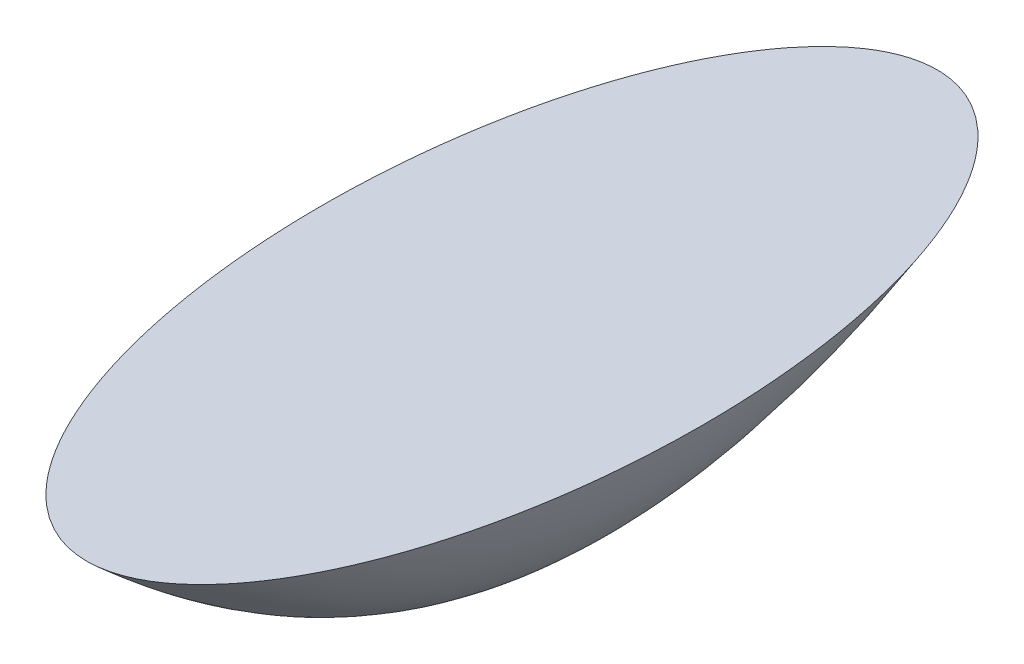
ISO-10303-21;
HEADER;
FILE_DESCRIPTION(('STEP AP214'),'2;1');
FILE_NAME('part.step','',(''),(''),'','','');
FILE_SCHEMA(('AUTOMOTIVE_DESIGN { 1 0 10303 214 1 1 1 1 }'));
ENDSEC;
DATA;
#1=APPLICATION_CONTEXT('core data for automotive mechanical design processes');
#2=APPLICATION_PROTOCOL_DEFINITION('international standard','automotive_design',2000,#1);
#3=PRODUCT_CONTEXT('',#1,'mechanical');
#4=PRODUCT('Part','Part','',(#3));
#5=PRODUCT_RELATED_PRODUCT_CATEGORY('part','',(#4));
#6=PRODUCT_DEFINITION_FORMATION('','',#4);
#7=PRODUCT_DEFINITION_CONTEXT('part definition',#1,'design');
#8=PRODUCT_DEFINITION('design','',#6,#7);
#9=PRODUCT_DEFINITION_SHAPE('','',#8);
#10=(LENGTH_UNIT() NAMED_UNIT(*) SI_UNIT(.MILLI.,.METRE.));
#11=(NAMED_UNIT(*) PLANE_ANGLE_UNIT() SI_UNIT($,.RADIAN.));
#12=(NAMED_UNIT(*) SI_UNIT($,.STERADIAN.) SOLID_ANGLE_UNIT());
#13=UNCERTAINTY_MEASURE_WITH_UNIT(LENGTH_MEASURE(1.E-05),#10,'distance_accuracy_value','');
#14=(GEOMETRIC_REPRESENTATION_CONTEXT(3) GLOBAL_UNCERTAINTY_ASSIGNED_CONTEXT((#13)) GLOBAL_UNIT_ASSIGNED_CONTEXT((#10,
#11,#12)) REPRESENTATION_CONTEXT('',''));
#15=CARTESIAN_POINT('',(0.,0.,0.));
#16=DIRECTION('',(0.,0.,1.));
#17=DIRECTION('',(1.,0.,0.));
#18=AXIS2_PLACEMENT_3D('',#15,#16,#17);
#19=CARTESIAN_POINT('',(-131.817131851053,275.377780694619,-329.538349323902));
#20=CARTESIAN_POINT('',(-131.817131851053,165.529295048695,-219.689863667199));
#21=CARTESIAN_POINT('',(-131.817131851053,110.605053421941,-109.841375351829));
#22=CARTESIAN_POINT('',(-131.817131851053,110.605053421941,109.855594345668));
#23=CARTESIAN_POINT('',(-131.817131851053,165.529296654307,219.704075715817));
#24=CARTESIAN_POINT('',(-131.817131851053,275.377780694807,329.552559767096));
#25=CARTESIAN_POINT('',(0.00104996689613364,11.7414170596769,-329.538349323902));
#26=CARTESIAN_POINT('',(0.00104996689613364,-98.1070685884025,-219.689863669355));
#27=CARTESIAN_POINT('',(0.00104996689613364,-153.031310213001,-109.841375351829));
#28=CARTESIAN_POINT('',(0.00104996689613364,-153.031310213001,109.855594345668));
#29=CARTESIAN_POINT('',(0.00104996689613364,-98.1070669827903,219.704075717973));
#30=CARTESIAN_POINT('',(0.00104996689613364,11.741417059865,329.552559767096));
#31=CARTESIAN_POINT('',(131.819231784845,275.377780695602,-329.538349323902));
#32=CARTESIAN_POINT('',(131.819231784845,165.529295049679,-219.689863667199));
#33=CARTESIAN_POINT('',(131.819231784845,110.605053422924,-109.841375351829));
#34=CARTESIAN_POINT('',(131.819231784845,110.605053422924,109.855594345668));
#35=CARTESIAN_POINT('',(131.819231784845,165.529296655291,219.704075715817));
#36=CARTESIAN_POINT('',(131.819231784845,275.37778069579,329.552559767096));
#37=B_SPLINE_SURFACE_WITH_KNOTS('',2,3,((#19,#20,#21,#22,#23,#24),(#25,#26,#27,#28,#29,#30),
(#31,#32,#33,#34,#35,#36)),.UNSPECIFIED.,.F.,.F.,.F.,(3,3),(4,2,4),(0.,1.),(0.,
0.499999980539483,1.),.UNSPECIFIED.);
#38=CARTESIAN_POINT('',(131.819231784845,110.605053422911,0.00710522449427424));
#39=CARTESIAN_POINT('',(131.819236901914,110.605053422914,-5.6312068840726));
#40=CARTESIAN_POINT('',(131.746924535443,110.605053422902,-11.2696097745448));
#41=CARTESIAN_POINT('',(131.457151012734,110.605053422893,-22.5431106804651));
#42=CARTESIAN_POINT('',(131.239677905515,110.605053422896,-28.1782083855644));
#43=CARTESIAN_POINT('',(130.657948351386,110.605053422899,-39.4413551495135));
#44=CARTESIAN_POINT('',(130.293678881957,110.605053422898,-45.0694035385636));
#45=CARTESIAN_POINT('',(129.415589206601,110.605053422897,-56.3145848945942));
#46=CARTESIAN_POINT('',(128.90174979692,110.605053422897,-61.9317163666315));
#47=CARTESIAN_POINT('',(127.719309885073,110.605053422897,-73.162207951627));
#48=CARTESIAN_POINT('',(127.050370700617,110.605053422897,-78.7755324507598));
#49=CARTESIAN_POINT('',(125.553059882345,110.605053422897,-89.980808232976));
#50=CARTESIAN_POINT('',(124.724694895729,110.605053422897,-95.5727603972603));
#51=CARTESIAN_POINT('',(123.357472267486,110.605053422897,-103.939704413103));
#52=CARTESIAN_POINT('',(122.880988198742,110.605053422897,-106.725002988963));
#53=CARTESIAN_POINT('',(121.885389325326,110.605053422897,-112.287958120392));
#54=CARTESIAN_POINT('',(121.366275120903,110.605053422897,-115.065614782993));
#55=CARTESIAN_POINT('',(120.284339744277,110.605053422897,-120.611998687119));
#56=CARTESIAN_POINT('',(119.72152475523,110.605053422897,-123.380727134357));
#57=CARTESIAN_POINT('',(118.550834270128,110.605053422897,-128.908605362329));
#58=CARTESIAN_POINT('',(117.942959396341,110.605053422897,-131.667755274791));
#59=CARTESIAN_POINT('',(116.570652850811,110.605053422897,-137.655562346406));
#60=CARTESIAN_POINT('',(115.7974037215,110.605053422897,-140.882204896665));
#61=CARTESIAN_POINT('',(114.184126891419,110.605053422897,-147.318724459241));
#62=CARTESIAN_POINT('',(113.344100052728,110.605053422897,-150.528601687424));
#63=CARTESIAN_POINT('',(111.594203591743,110.605053422897,-156.929431737577));
#64=CARTESIAN_POINT('',(110.684331142427,110.605053422897,-160.120383787908));
#65=CARTESIAN_POINT('',(108.791174756168,110.605053422897,-166.481051144587));
#66=CARTESIAN_POINT('',(107.807878566599,110.605053422897,-169.650762809828));
#67=CARTESIAN_POINT('',(105.763679446016,110.605053422897,-175.966466755615));
#68=CARTESIAN_POINT('',(104.702746514373,110.605053422897,-179.11244934317));
#69=CARTESIAN_POINT('',(102.503822894573,110.605053422897,-185.362296014735));
#70=CARTESIAN_POINT('',(101.366181322365,110.605053422897,-188.466282714375));
#71=CARTESIAN_POINT('',(99.0046275219216,110.605053422897,-194.641630934218));
#72=CARTESIAN_POINT('',(97.780708215792,110.605053422897,-197.712989753917));
#73=CARTESIAN_POINT('',(95.2412366965442,110.605053422897,-203.816516992132));
#74=CARTESIAN_POINT('',(93.9257133938889,110.605053422897,-206.848697420489));
#75=CARTESIAN_POINT('',(91.1965950613179,110.605053422897,-212.867007276454));
#76=CARTESIAN_POINT('',(89.7830488651813,110.605053422897,-215.853158741592));
#77=CARTESIAN_POINT('',(87.5832802864457,110.605053422897,-220.292237558648));
#78=CARTESIAN_POINT('',(86.8369106774038,110.605053422897,-221.765002306232));
#79=CARTESIAN_POINT('',(85.3165132278712,110.605053422897,-224.696170793528));
#80=CARTESIAN_POINT('',(84.5424860691656,110.605053422897,-226.154574886116));
#81=CARTESIAN_POINT('',(83.0040807956517,110.605053422897,-228.98495829733));
#82=CARTESIAN_POINT('',(82.2410740723168,110.605053422897,-230.357682920635));
#83=CARTESIAN_POINT('',(80.6879395647974,110.605053422897,-233.087666798938));
#84=CARTESIAN_POINT('',(79.8978125385209,110.605053422897,-234.444926484712));
#85=CARTESIAN_POINT('',(78.2892962083819,110.605053422897,-237.142575265063));
#86=CARTESIAN_POINT('',(77.4709074088112,110.605053422897,-238.482964660085));
#87=CARTESIAN_POINT('',(75.8046435670021,110.605053422897,-241.145302266543));
#88=CARTESIAN_POINT('',(74.9567685843804,110.605053422897,-242.467250515257));
#89=CARTESIAN_POINT('',(73.2286304641777,110.605053422897,-245.093363521077));
#90=CARTESIAN_POINT('',(72.3483098279402,110.605053422897,-246.397490479856));
#91=CARTESIAN_POINT('',(70.5553949961699,110.605053422897,-248.983410870888));
#92=CARTESIAN_POINT('',(69.6428004488697,110.605053422897,-250.265204059488));
#93=CARTESIAN_POINT('',(67.783868257861,110.605053422897,-252.804176701715));
#94=CARTESIAN_POINT('',(66.8375296700955,110.605053422897,-254.061355465176));
#95=CARTESIAN_POINT('',(64.9096707842895,110.605053422897,-256.548368857336));
#96=CARTESIAN_POINT('',(63.9281518500937,110.605053422897,-257.77820454306));
#97=CARTESIAN_POINT('',(61.5803742579378,110.605053422897,-260.630318653604));
#98=CARTESIAN_POINT('',(60.1990645654695,110.605053422897,-262.240271819415));
#99=CARTESIAN_POINT('',(57.3655704647338,110.605053422897,-265.396834571661));
#100=CARTESIAN_POINT('',(55.9133826977143,110.605053422897,-266.943441149844));
#101=CARTESIAN_POINT('',(52.9337285995371,110.605053422897,-269.96364434383));
#102=CARTESIAN_POINT('',(51.406237101524,110.605053422897,-271.437216216602));
#103=CARTESIAN_POINT('',(48.2771502822262,110.605053422897,-274.294728039016));
#104=CARTESIAN_POINT('',(46.6757741920469,110.605053422897,-275.678907173716));
#105=CARTESIAN_POINT('',(43.3923947003062,110.605053422897,-278.347654140954));
#106=CARTESIAN_POINT('',(41.7104117081302,110.605053422897,-279.632246975018));
#107=CARTESIAN_POINT('',(38.2648439864844,110.605053422897,-282.084913000478));
#108=CARTESIAN_POINT('',(36.5013150012716,110.605053422897,-283.253064116005));
#109=CARTESIAN_POINT('',(33.1046001727457,110.605053422897,-285.325242310632));
#110=CARTESIAN_POINT('',(31.4805573525182,110.605053422897,-286.244171964807));
#111=CARTESIAN_POINT('',(28.9984561075242,110.605053422897,-287.533373210003));
#112=CARTESIAN_POINT('',(28.1633814423248,110.605053422897,-287.948256413143));
#113=CARTESIAN_POINT('',(26.4783267528622,110.605053422897,-288.74649515801));
#114=CARTESIAN_POINT('',(25.6283479937347,110.605053422897,-289.129853360172));
#115=CARTESIAN_POINT('',(23.9146736729547,110.605053422897,-289.862970876564));
#116=CARTESIAN_POINT('',(23.0509875046789,110.605053422897,-290.212752132236));
#117=CARTESIAN_POINT('',(21.310270219246,110.605053422897,-290.87714724743));
#118=CARTESIAN_POINT('',(20.4332404196476,110.605053422897,-291.191764553787));
#119=CARTESIAN_POINT('',(18.6666711994427,110.605053422897,-291.784133385517));
#120=CARTESIAN_POINT('',(17.777130236528,110.605053422897,-292.061880320869));
#121=CARTESIAN_POINT('',(15.986978898394,110.605053422897,-292.578760023272));
#122=CARTESIAN_POINT('',(15.0863693328072,110.605053422897,-292.817895596742));
#123=CARTESIAN_POINT('',(12.9625664889716,110.605053422897,-293.331718388378));
#124=CARTESIAN_POINT('',(11.7353947087432,110.605053422897,-293.590156795481));
#125=CARTESIAN_POINT('',(9.26744075196084,110.605053422897,-294.031154519234));
#126=CARTESIAN_POINT('',(8.02665803387199,110.605053422897,-294.21371080546));
#127=CARTESIAN_POINT('',(5.53608468520924,110.605053422897,-294.500543952638));
#128=CARTESIAN_POINT('',(4.28629438605396,110.605053422897,-294.604823678947));
#129=CARTESIAN_POINT('',(1.78296383283059,110.605053422897,-294.733669153628));
#130=CARTESIAN_POINT('',(0.529424783189259,110.605053422897,-294.75825822075));
#131=CARTESIAN_POINT('',(-1.97670366219857,110.605053422897,-294.727452805287));
#132=CARTESIAN_POINT('',(-3.22929301678431,110.605053422897,-294.672055034389));
#133=CARTESIAN_POINT('',(-5.72833600614614,110.605053422897,-294.482027279575));
#134=CARTESIAN_POINT('',(-6.97479035670515,110.605053422897,-294.347406770832));
#135=CARTESIAN_POINT('',(-9.04867616497311,110.605053422897,-294.057790707137));
#136=CARTESIAN_POINT('',(-9.87914594911175,110.605053422897,-293.924043571924));
#137=CARTESIAN_POINT('',(-11.5339375516866,110.605053422897,-293.622475175459));
#138=CARTESIAN_POINT('',(-12.3582590720268,110.605053422897,-293.454652273052));
#139=CARTESIAN_POINT('',(-13.9992889430298,110.605053422897,-293.085913658782));
#140=CARTESIAN_POINT('',(-14.8159986785882,110.605053422897,-292.885004096029));
#141=CARTESIAN_POINT('',(-16.4409222821768,110.605053422897,-292.451132641142));
#142=CARTESIAN_POINT('',(-17.2491354152515,110.605053422897,-292.218168000404));
#143=CARTESIAN_POINT('',(-18.8562438569173,110.605053422897,-291.721310301097));
#144=CARTESIAN_POINT('',(-19.6551365101579,110.605053422897,-291.457408654444));
#145=CARTESIAN_POINT('',(-21.2425469465675,110.605053422897,-290.899997187327));
#146=CARTESIAN_POINT('',(-22.0310638002047,110.605053422897,-290.606484734274));
#147=CARTESIAN_POINT('',(-24.3800368220498,110.605053422897,-289.683438677767));
#148=CARTESIAN_POINT('',(-25.9240132083516,110.605053422897,-289.011365899978));
#149=CARTESIAN_POINT('',(-28.5663761838842,110.605053422897,-287.753688274746));
#150=CARTESIAN_POINT('',(-29.6759526039601,110.605053422897,-287.19124758773));
#151=CARTESIAN_POINT('',(-31.8675416207453,110.605053422897,-286.014709092202));
#152=CARTESIAN_POINT('',(-32.9495514263006,110.605053422897,-285.400606079682));
#153=CARTESIAN_POINT('',(-35.0855742399466,110.605053422897,-284.124769842363));
#154=CARTESIAN_POINT('',(-36.1395772472485,110.605053422897,-283.46301990837));
#155=CARTESIAN_POINT('',(-38.2188712178073,110.605053422897,-282.09611144669));
#156=CARTESIAN_POINT('',(-39.2441629364445,110.605053422897,-281.390954062596));
#157=CARTESIAN_POINT('',(-42.2814746110068,110.605053422897,-279.212784954476));
#158=CARTESIAN_POINT('',(-44.2507783262192,110.605053422897,-277.679585419671));
#159=CARTESIAN_POINT('',(-47.1202574825088,110.605053422897,-275.280546991124));
#160=CARTESIAN_POINT('',(-48.0627219576209,110.605053422897,-274.464278772343));
#161=CARTESIAN_POINT('',(-49.920415842759,110.605053422897,-272.801262407115));
#162=CARTESIAN_POINT('',(-50.8356456289027,110.605053422897,-271.954514681955));
#163=CARTESIAN_POINT('',(-53.2771723434341,110.605053422897,-269.6247448403));
#164=CARTESIAN_POINT('',(-54.7780924498219,110.605053422897,-268.115060803884));
#165=CARTESIAN_POINT('',(-57.7068081152078,110.605053422897,-265.025522494329));
#166=CARTESIAN_POINT('',(-59.1345735583322,110.605053422897,-263.445639814103));
#167=CARTESIAN_POINT('',(-61.9210612744457,110.605053422897,-260.224964002042));
#168=CARTESIAN_POINT('',(-63.279751149909,110.605053422897,-258.584142902197));
#169=CARTESIAN_POINT('',(-65.9313082690923,110.605053422897,-255.250318530862));
#170=CARTESIAN_POINT('',(-67.2241763261901,110.605053422897,-253.557315904608));
#171=CARTESIAN_POINT('',(-69.7504138243774,110.605053422897,-250.122420574327));
#172=CARTESIAN_POINT('',(-70.9836605793192,110.605053422897,-248.380437829042));
#173=CARTESIAN_POINT('',(-73.3910603718785,110.605053422897,-244.857141519316));
#174=CARTESIAN_POINT('',(-74.5652353837155,110.605053422897,-243.075842940166));
#175=CARTESIAN_POINT('',(-76.8582490683516,110.605053422897,-239.47820299065));
#176=CARTESIAN_POINT('',(-77.9770912901221,110.605053422897,-237.661863878151));
#177=CARTESIAN_POINT('',(-80.162627808021,110.605053422897,-233.998056173215));
#178=CARTESIAN_POINT('',(-81.2293208326219,110.605053422897,-232.150586823221));
#179=CARTESIAN_POINT('',(-83.1206306032499,110.605053422897,-228.772270775688));
#180=CARTESIAN_POINT('',(-83.9535354520748,110.605053422897,-227.246050724681));
#181=CARTESIAN_POINT('',(-85.5879747645065,110.605053422897,-224.176867517481));
#182=CARTESIAN_POINT('',(-86.3895085254266,110.605053422897,-222.633903987236));
#183=CARTESIAN_POINT('',(-87.9627699619254,110.605053422897,-219.532180740632));
#184=CARTESIAN_POINT('',(-88.7344870193627,110.605053422897,-217.973415642076));
#185=CARTESIAN_POINT('',(-90.2490333134034,110.605053422897,-214.841899758221));
#186=CARTESIAN_POINT('',(-90.991861908398,110.605053422897,-213.269148663248));
#187=CARTESIAN_POINT('',(-93.1794810193822,110.605053422897,-208.530042449978));
#188=CARTESIAN_POINT('',(-94.5826267160743,110.605053422897,-205.344375411423));
#189=CARTESIAN_POINT('',(-97.2863062576427,110.605053422897,-198.928679909541));
#190=CARTESIAN_POINT('',(-98.5868037365406,110.605053422897,-195.698636196132));
#191=CARTESIAN_POINT('',(-101.091498832431,110.605053422897,-189.201876137843));
#192=CARTESIAN_POINT('',(-102.295706630097,110.605053422897,-185.935163711691));
#193=CARTESIAN_POINT('',(-104.617143546029,110.605053422897,-179.361009906165));
#194=CARTESIAN_POINT('',(-105.734126009822,110.605053422897,-176.053481627497));
#195=CARTESIAN_POINT('',(-107.882214278505,110.605053422897,-169.412364418261));
#196=CARTESIAN_POINT('',(-108.913358821305,110.605053422897,-166.078787994159));
#197=CARTESIAN_POINT('',(-110.894699925456,110.605053422897,-159.38838373367));
#198=CARTESIAN_POINT('',(-111.844911563301,110.605053422897,-156.03156035435));
#199=CARTESIAN_POINT('',(-113.668529727862,110.605053422897,-149.297253985471));
#200=CARTESIAN_POINT('',(-114.541938424678,110.605053422897,-145.919771582527));
#201=CARTESIAN_POINT('',(-116.215469004955,110.605053422897,-139.146547482309));
#202=CARTESIAN_POINT('',(-117.015587451659,110.605053422897,-135.75080493667));
#203=CARTESIAN_POINT('',(-118.393795054525,110.605053422897,-129.618481904476));
#204=CARTESIAN_POINT('',(-118.984450416483,110.605053422897,-126.884714456938));
#205=CARTESIAN_POINT('',(-120.121923040819,110.605053422897,-121.408041176267));
#206=CARTESIAN_POINT('',(-120.66873977088,110.605053422897,-118.66513523259));
#207=CARTESIAN_POINT('',(-121.719889095145,110.605053422897,-113.170460634292));
#208=CARTESIAN_POINT('',(-122.224210631133,110.605053422897,-110.41868986507));
#209=CARTESIAN_POINT('',(-123.191302239708,110.605053422897,-104.907844679317));
#210=CARTESIAN_POINT('',(-123.654071750167,110.605053422897,-102.148770164499));
#211=CARTESIAN_POINT('',(-124.98187245884,110.605053422897,-93.8597450899949));
#212=CARTESIAN_POINT('',(-125.786026505541,110.605053422897,-88.3199321877057));
#213=CARTESIAN_POINT('',(-127.238797852488,110.605053422897,-77.218079046708));
#214=CARTESIAN_POINT('',(-127.887358990413,110.605053422897,-71.65603151654));
#215=CARTESIAN_POINT('',(-129.033756717206,110.605053422897,-60.5151081158674));
#216=CARTESIAN_POINT('',(-129.531557509803,110.605053422897,-54.9362285658787));
#217=CARTESIAN_POINT('',(-130.379989547794,110.605053422897,-43.7670429798074));
#218=CARTESIAN_POINT('',(-130.730613332846,110.605053422897,-38.176736378922));
#219=CARTESIAN_POINT('',(-131.287131286362,110.605053422897,-26.990847000773));
#220=CARTESIAN_POINT('',(-131.493074634802,110.605053422897,-21.3952666644304));
#221=CARTESIAN_POINT('',(-131.761873607114,110.605053422897,-10.2021351937114));
#222=CARTESIAN_POINT('',(-131.824766417251,110.605053422897,-4.60458494991425));
#223=CARTESIAN_POINT('',(-131.80802504879,110.605053422897,6.58890795260856));
#224=CARTESIAN_POINT('',(-131.728426374497,110.605053422897,12.1848506644118));
#225=CARTESIAN_POINT('',(-131.42623904864,110.605053422897,23.3715243972357));
#226=CARTESIAN_POINT('',(-131.203685163588,110.605053422897,28.9622563545279));
#227=CARTESIAN_POINT('',(-130.614081480894,110.605053422897,40.1348660549372));
#228=CARTESIAN_POINT('',(-130.247063721659,110.605053422897,45.7167454859233));
#229=CARTESIAN_POINT('',(-129.365913787211,110.605053422897,56.8680233740685));
#230=CARTESIAN_POINT('',(-128.85180559698,110.605053422897,62.4374237170014));
#231=CARTESIAN_POINT('',(-127.763572220607,110.605053422897,72.7018834213317));
#232=CARTESIAN_POINT('',(-127.210953994672,110.605053422897,77.3992306478283));
#233=CARTESIAN_POINT('',(-125.994665052026,110.605053422897,86.7792796904432));
#234=CARTESIAN_POINT('',(-125.331001157201,110.605053422897,91.4619823882305));
#235=CARTESIAN_POINT('',(-123.888769867372,110.605053422897,100.809757185984));
#236=CARTESIAN_POINT('',(-123.110200919123,110.605053422897,105.474829046748));
#237=CARTESIAN_POINT('',(-121.433343037987,110.605053422897,114.784251449958));
#238=CARTESIAN_POINT('',(-120.535034583155,110.605053422897,119.428598485618));
#239=CARTESIAN_POINT('',(-118.614219038526,110.605053422897,128.686021391914));
#240=CARTESIAN_POINT('',(-117.591855549342,110.605053422897,133.299127014381));
#241=CARTESIAN_POINT('',(-115.415255713009,110.605053422897,142.494343467648));
#242=CARTESIAN_POINT('',(-114.261018307191,110.605053422897,147.07645404931));
#243=CARTESIAN_POINT('',(-112.424735897283,110.605053422897,153.920879490181));
#244=CARTESIAN_POINT('',(-111.795209864791,110.605053422897,156.197379404203));
#245=CARTESIAN_POINT('',(-110.499942603315,110.605053422897,160.740040563524));
#246=CARTESIAN_POINT('',(-109.834201948523,110.605053422897,163.006201972126));
#247=CARTESIAN_POINT('',(-108.465334583366,110.605053422897,167.526752946307));
#248=CARTESIAN_POINT('',(-107.762214827395,110.605053422897,169.781144616531));
#249=CARTESIAN_POINT('',(-106.317057190648,110.605053422897,174.277385320907));
#250=CARTESIAN_POINT('',(-105.575019895037,110.605053422897,176.519234543087));
#251=CARTESIAN_POINT('',(-103.864812955591,110.605053422897,181.533404210728));
#252=CARTESIAN_POINT('',(-102.885578807629,110.605053422897,184.301963217284));
#253=CARTESIAN_POINT('',(-100.861157526519,110.605053422897,189.814801883245));
#254=CARTESIAN_POINT('',(-99.8159722289198,110.605053422897,192.559082215951));
#255=CARTESIAN_POINT('',(-97.6557612144554,110.605053422897,198.020216793456));
#256=CARTESIAN_POINT('',(-96.5407321693704,110.605053422897,200.737069724102));
#257=CARTESIAN_POINT('',(-94.2362741519486,110.605053422897,206.139925654601));
#258=CARTESIAN_POINT('',(-93.0468260290691,110.605053422897,208.825920501403));
#259=CARTESIAN_POINT('',(-90.5905591048623,110.605053422897,214.157981816695));
#260=CARTESIAN_POINT('',(-89.3238467727445,110.605053422897,216.804097232849));
#261=CARTESIAN_POINT('',(-86.7060790048237,110.605053422897,222.054381861466));
#262=CARTESIAN_POINT('',(-85.3550234398331,110.605053422897,224.658551009673));
#263=CARTESIAN_POINT('',(-82.5627639391216,110.605053422897,229.817120541622));
#264=CARTESIAN_POINT('',(-81.121589298782,110.605053422897,232.371536748268));
#265=CARTESIAN_POINT('',(-78.1420197421328,110.605053422897,237.422230533008));
#266=CARTESIAN_POINT('',(-76.603654399741,110.605053422897,239.918525483277));
#267=CARTESIAN_POINT('',(-73.8425809879198,110.605053422897,244.191201883513));
#268=CARTESIAN_POINT('',(-72.6440954183743,110.605053422897,245.983251191713));
#269=CARTESIAN_POINT('',(-70.1865674191748,110.605053422897,249.525330057409));
#270=CARTESIAN_POINT('',(-68.9275277125213,110.605053422897,251.275361499069));
#271=CARTESIAN_POINT('',(-66.3449258486076,110.605053422897,254.72762145414));
#272=CARTESIAN_POINT('',(-65.0213550437867,110.605053422897,256.429843512364));
#273=CARTESIAN_POINT('',(-62.3064360507958,110.605053422897,259.778280296729));
#274=CARTESIAN_POINT('',(-60.9151171572131,110.605053422897,261.42451871655));
#275=CARTESIAN_POINT('',(-58.060132616736,110.605053422897,264.653008395531));
#276=CARTESIAN_POINT('',(-56.5964726774579,110.605053422897,266.235264684948));
#277=CARTESIAN_POINT('',(-53.5929841167159,110.605053422897,269.325177111052));
#278=CARTESIAN_POINT('',(-52.0531730677905,110.605053422897,270.832850299302));
#279=CARTESIAN_POINT('',(-48.7286349449915,110.605053422897,273.914174667219));
#280=CARTESIAN_POINT('',(-46.9350866235981,110.605053422897,275.478395616862));
#281=CARTESIAN_POINT('',(-44.1682843329698,110.605053422897,277.730580786464));
#282=CARTESIAN_POINT('',(-43.2331869370919,110.605053422897,278.465677035818));
#283=CARTESIAN_POINT('',(-41.3371041551581,110.605053422897,279.901660909538));
#284=CARTESIAN_POINT('',(-40.3761180664642,110.605053422897,280.602547603975));
#285=CARTESIAN_POINT('',(-37.456523515433,110.605053422897,282.647489639474));
#286=CARTESIAN_POINT('',(-35.4583120926063,110.605053422897,283.936262564329));
#287=CARTESIAN_POINT('',(-32.3844865719309,110.605053422897,285.737157037423));
#288=CARTESIAN_POINT('',(-31.3471277918533,110.605053422897,286.315410507333));
#289=CARTESIAN_POINT('',(-29.2473047142682,110.605053422897,287.424311641386));
#290=CARTESIAN_POINT('',(-28.1848438337223,110.605053422897,287.954965738243));
#291=CARTESIAN_POINT('',(-26.0293771797599,110.605053422897,288.967915472916));
#292=CARTESIAN_POINT('',(-24.9362274919315,110.605053422897,289.449905244242));
#293=CARTESIAN_POINT('',(-22.7270177056462,110.605053422897,290.358006291321));
#294=CARTESIAN_POINT('',(-21.6109597067206,110.605053422897,290.784122661622));
#295=CARTESIAN_POINT('',(-19.3578442343121,110.605053422897,291.576708464019));
#296=CARTESIAN_POINT('',(-18.2207873099853,110.605053422897,291.943179453488));
#297=CARTESIAN_POINT('',(-15.9291453656171,110.605053422897,292.612607592021));
#298=CARTESIAN_POINT('',(-14.774576314257,110.605053422897,292.915619264754));
#299=CARTESIAN_POINT('',(-12.4499326255134,110.605053422897,293.455325822307));
#300=CARTESIAN_POINT('',(-11.2798571472239,110.605053422897,293.692017095066));
#301=CARTESIAN_POINT('',(-8.92783280482023,110.605053422897,294.096370537766));
#302=CARTESIAN_POINT('',(-7.74588420234474,110.605053422897,294.264034225411));
#303=CARTESIAN_POINT('',(-5.36789294027801,110.605053422897,294.529023009384));
#304=CARTESIAN_POINT('',(-4.17180897219268,110.605053422897,294.625978633864));
#305=CARTESIAN_POINT('',(-1.77589214282959,110.605053422897,294.746917784679));
#306=CARTESIAN_POINT('',(-0.576059112224028,110.605053422897,294.770897965932));
#307=CARTESIAN_POINT('',(1.82277979770677,110.605053422897,294.745573704647));
#308=CARTESIAN_POINT('',(3.02178570979483,110.605053422897,294.696272354046));
#309=CARTESIAN_POINT('',(5.41497902436691,110.605053422897,294.524984506126));
#310=CARTESIAN_POINT('',(6.60916470784696,110.605053422897,294.402974049785));
#311=CARTESIAN_POINT('',(8.98810426027697,110.605053422897,294.087756669741));
#312=CARTESIAN_POINT('',(10.1728578201284,110.605053422897,293.894547422526));
#313=CARTESIAN_POINT('',(12.5289763198011,110.605053422897,293.439228287002));
#314=CARTESIAN_POINT('',(13.7003420644722,110.605053422897,293.177122563596));
#315=CARTESIAN_POINT('',(15.6774596851222,110.605053422897,292.675475707954));
#316=CARTESIAN_POINT('',(16.4875225589183,110.605053422897,292.452734834355));
#317=CARTESIAN_POINT('',(18.0984446572536,110.605053422897,291.976090456154));
#318=CARTESIAN_POINT('',(18.89930341634,110.605053422897,291.722185383092));
#319=CARTESIAN_POINT('',(21.2864274977993,110.605053422897,290.91563379613));
#320=CARTESIAN_POINT('',(22.8577049131967,110.605053422897,290.318032019363));
#321=CARTESIAN_POINT('',(25.9541656330461,110.605053422897,289.013615523226));
#322=CARTESIAN_POINT('',(27.4793418139326,110.605053422897,288.306784027775));
#323=CARTESIAN_POINT('',(30.4800594890213,110.605053422897,286.794739421991));
#324=CARTESIAN_POINT('',(31.9555938071925,110.605053422897,285.989512165225));
#325=CARTESIAN_POINT('',(35.8316274807158,110.605053422897,283.71903330575));
#326=CARTESIAN_POINT('',(38.1860753449191,110.605053422897,282.174392233767));
#327=CARTESIAN_POINT('',(41.6075580320218,110.605053422897,279.706679719809));
#328=CARTESIAN_POINT('',(42.7301283834227,110.605053422897,278.85860216852));
#329=CARTESIAN_POINT('',(44.9393611508443,110.605053422897,277.116763060775));
#330=CARTESIAN_POINT('',(46.0260248250241,110.605053422897,276.223003107818));
#331=CARTESIAN_POINT('',(48.1667945534189,110.605053422897,274.391973382884));
#332=CARTESIAN_POINT('',(49.2208091594966,110.605053422897,273.454597084498));
#333=CARTESIAN_POINT('',(51.2943388229739,110.605053422897,271.542454897192));
#334=CARTESIAN_POINT('',(52.3138534991125,110.605053422897,270.567688595326));
#335=CARTESIAN_POINT('',(54.3192949637571,110.605053422897,268.584499739556));
#336=CARTESIAN_POINT('',(55.3052261486088,110.605053422897,267.576081625422));
#337=CARTESIAN_POINT('',(57.2447362742805,110.605053422897,265.528698093389));
#338=CARTESIAN_POINT('',(58.1983155423147,110.605053422897,264.489732984646));
#339=CARTESIAN_POINT('',(60.8254489676692,110.605053422897,261.541033301226));
#340=CARTESIAN_POINT('',(62.4641654435041,110.605053422897,259.600138458242));
#341=CARTESIAN_POINT('',(65.6479460136736,110.605053422897,255.641969799749));
#342=CARTESIAN_POINT('',(67.1929666299571,110.605053422897,253.624661220471));
#343=CARTESIAN_POINT('',(70.1958986269389,110.605053422897,249.524765259736));
#344=CARTESIAN_POINT('',(71.6537646409968,110.605053422897,247.442144726619));
#345=CARTESIAN_POINT('',(74.4875152259585,110.605053422897,243.222004658319));
#346=CARTESIAN_POINT('',(75.8633995197636,110.605053422897,241.084484937612));
#347=CARTESIAN_POINT('',(78.5416056657425,110.605053422897,236.757494214009));
#348=CARTESIAN_POINT('',(79.8437603075553,110.605053422897,234.567919952019));
#349=CARTESIAN_POINT('',(82.3757269246617,110.605053422897,230.148623848404));
#350=CARTESIAN_POINT('',(83.6055685521919,110.605053422897,227.918918959331));
#351=CARTESIAN_POINT('',(85.9978733624858,110.605053422897,223.42398148498));
#352=CARTESIAN_POINT('',(87.1603426575358,110.605053422897,221.158752146387));
#353=CARTESIAN_POINT('',(89.4220758250986,110.605053422897,216.596955095009));
#354=CARTESIAN_POINT('',(90.5213387106706,110.605053422897,214.300386893574));
#355=CARTESIAN_POINT('',(92.4829864107433,110.605053422897,210.06261269414));
#356=CARTESIAN_POINT('',(93.354436392331,110.605053422897,208.125590434863));
#357=CARTESIAN_POINT('',(95.0577518438271,110.605053422897,204.234173862216));
#358=CARTESIAN_POINT('',(95.8896164019914,110.605053422897,202.279779149946));
#359=CARTESIAN_POINT('',(97.5157799442021,110.605053422897,198.354559834736));
#360=CARTESIAN_POINT('',(98.3100643625862,110.605053422897,196.383729203942));
#361=CARTESIAN_POINT('',(99.8623038264117,110.605053422897,192.427840608994));
#362=CARTESIAN_POINT('',(100.620259104461,110.605053422897,190.442782736027));
#363=CARTESIAN_POINT('',(102.101707114779,110.605053422897,186.45860162298));
#364=CARTESIAN_POINT('',(102.825180506363,110.605053422897,184.459471194619));
#365=CARTESIAN_POINT('',(104.238542328602,110.605053422897,180.449360245578));
#366=CARTESIAN_POINT('',(104.928430150511,110.605053422897,178.438379510849));
#367=CARTESIAN_POINT('',(106.950042972901,110.605053422897,172.387790576696));
#368=CARTESIAN_POINT('',(108.233222833365,110.605053422897,168.331871457652));
#369=CARTESIAN_POINT('',(110.678545265741,110.605053422897,160.184163614425));
#370=CARTESIAN_POINT('',(111.840694975848,110.605053422897,156.092377021105));
#371=CARTESIAN_POINT('',(114.052400671609,110.605053422897,147.874055233969));
#372=CARTESIAN_POINT('',(115.101840554144,110.605053422897,143.747488842555));
#373=CARTESIAN_POINT('',(117.092421268438,110.605053422897,135.470343676197));
#374=CARTESIAN_POINT('',(118.033610547104,110.605053422897,131.319776523047));
#375=CARTESIAN_POINT('',(119.813190613586,110.605053422897,122.997704024934));
#376=CARTESIAN_POINT('',(120.651605005166,110.605053422897,118.826203717529));
#377=CARTESIAN_POINT('',(122.230156105318,110.605053422897,110.465161058256));
#378=CARTESIAN_POINT('',(122.970303558468,110.605053422897,106.275620730699));
#379=CARTESIAN_POINT('',(124.356056519368,110.605053422897,97.8812215383609));
#380=CARTESIAN_POINT('',(125.00166792214,110.605053422897,93.6763636455155));
#381=CARTESIAN_POINT('',(126.129315457971,110.605053422897,85.7601552363323));
#382=CARTESIAN_POINT('',(126.621686057426,110.605053422897,82.0502705462547));
#383=CARTESIAN_POINT('',(127.537404219581,110.605053422897,74.6221134904754));
#384=CARTESIAN_POINT('',(127.960753943373,110.605053422897,70.903841391087));
#385=CARTESIAN_POINT('',(128.73990930566,110.605053422897,63.4602847087333));
#386=CARTESIAN_POINT('',(129.095715782113,110.605053422897,59.7350002133448));
#387=CARTESIAN_POINT('',(129.740989295538,110.605053422897,52.2787530911953));
#388=CARTESIAN_POINT('',(130.030457329175,110.605053422897,48.5477905505888));
#389=CARTESIAN_POINT('',(130.543660280063,110.605053422897,41.0866161947302));
#390=CARTESIAN_POINT('',(130.767486924033,110.605053422897,37.3564106811955));
#391=CARTESIAN_POINT('',(131.150679823595,110.605053422898,29.8926947914495));
#392=CARTESIAN_POINT('',(131.310046066063,110.605053422898,26.1591844145655));
#393=CARTESIAN_POINT('',(131.564835861654,110.605053422897,18.6898751954888));
#394=CARTESIAN_POINT('',(131.660257634388,110.605053422894,14.9540762924756));
#395=CARTESIAN_POINT('',(131.787455471029,110.6050534229,7.48123332973439));
#396=CARTESIAN_POINT('',(131.819228393243,110.605053422909,3.74418921764862));
#397=CARTESIAN_POINT('',(131.819231784845,110.605053422911,0.00710522449427424));
#398=B_SPLINE_CURVE_WITH_KNOTS('',3,(#38,#39,#40,#41,#42,#43,#44,#45,#46,#47,#48,#49,#50,#51,
#52,#53,#54,#55,#56,#57,#58,#59,#60,#61,#62,#63,#64,#65,#66,#67,#68,#69,#70,#71,#72,#73,#74,#75,
#76,#77,#78,#79,#80,#81,#82,#83,#84,#85,#86,#87,#88,#89,#90,#91,#92,#93,#94,#95,#96,#97,#98,#99,
#100,#101,#102,#103,#104,#105,#106,#107,#108,#109,#110,#111,#112,#113,#114,#115,#116,#117,#118,
#119,#120,#121,#122,#123,#124,#125,#126,#127,#128,#129,#130,#131,#132,#133,#134,#135,#136,#137,
#138,#139,#140,#141,#142,#143,#144,#145,#146,#147,#148,#149,#150,#151,#152,#153,#154,#155,#156,
#157,#158,#159,#160,#161,#162,#163,#164,#165,#166,#167,#168,#169,#170,#171,#172,#173,#174,#175,
#176,#177,#178,#179,#180,#181,#182,#183,#184,#185,#186,#187,#188,#189,#190,#191,#192,#193,#194,
#195,#196,#197,#198,#199,#200,#201,#202,#203,#204,#205,#206,#207,#208,#209,#210,#211,#212,#213,
#214,#215,#216,#217,#218,#219,#220,#221,#222,#223,#224,#225,#226,#227,#228,#229,#230,#231,#232,
#233,#234,#235,#236,#237,#238,#239,#240,#241,#242,#243,#244,#245,#246,#247,#248,#249,#250,#251,
#252,#253,#254,#255,#256,#257,#258,#259,#260,#261,#262,#263,#264,#265,#266,#267,#268,#269,#270,
#271,#272,#273,#274,#275,#276,#277,#278,#279,#280,#281,#282,#283,#284,#285,#286,#287,#288,#289,
#290,#291,#292,#293,#294,#295,#296,#297,#298,#299,#300,#301,#302,#303,#304,#305,#306,#307,#308,
#309,#310,#311,#312,#313,#314,#315,#316,#317,#318,#319,#320,#321,#322,#323,#324,#325,#326,#327,
#328,#329,#330,#331,#332,#333,#334,#335,#336,#337,#338,#339,#340,#341,#342,#343,#344,#345,#346,
#347,#348,#349,#350,#351,#352,#353,#354,#355,#356,#357,#358,#359,#360,#361,#362,#363,#364,#365,
#366,#367,#368,#369,#370,#371,#372,#373,#374,#375,#376,#377,#378,#379,#380,#381,#382,#383,#384,
#385,#386,#387,#388,#389,#390,#391,#392,#393,#394,#395,#396,#397),.UNSPECIFIED.,.T.,.F.,(4,2,2,
2,2,2,2,2,2,2,2,2,2,2,2,2,2,2,2,2,2,2,2,2,2,2,2,2,2,2,2,2,2,2,2,2,2,2,2,2,2,2,2,2,2,2,2,2,2,2,2,
2,2,2,2,2,2,2,2,2,2,2,2,2,2,2,2,2,2,2,2,2,2,2,2,2,2,2,2,2,2,2,2,2,2,2,2,2,2,2,2,2,2,2,2,2,2,2,2,
2,2,2,2,2,2,2,2,2,2,2,2,2,2,2,2,2,2,2,2,2,2,2,2,2,2,2,2,2,2,2,2,2,2,2,2,2,2,2,2,2,2,2,2,2,2,2,2,
2,2,2,2,2,2,2,2,2,2,2,2,2,2,2,2,2,2,2,2,2,2,2,2,2,2,2,2,2,2,2,2,4),(0.,16.9146278299573,
33.8306484009856,50.7481699474372,67.6678645465317,84.6248595697967,101.581147730549,
110.058159151757,118.535051233878,127.01074611159,135.486323963349,145.439632098661,
155.392811760853,165.346394493546,175.301641963829,185.260756895038,195.177261364078,
205.094580293869,215.008783354865,224.918082283603,229.87111729449,234.824030292453,
239.535318900211,244.246475952617,248.957548984407,253.668612491669,258.388469200763,
263.10837736947,267.828417690804,272.548275226712,278.91020839816,285.272443340541,
291.636819179521,297.983392871576,304.328368036874,310.669068156481,316.262272948654,
319.059101863386,321.855694507362,324.650447047953,327.444925401141,330.239751315512,
333.034373999888,336.794242067432,340.554260274415,344.314140837079,348.072921099739,
351.831855892873,355.590341202383,358.113196802323,360.636173936911,363.1586827078,
365.681407909319,368.204835082765,370.728486802902,375.775483776786,379.506169197574,
383.23723086567,386.969607404933,390.701885654723,398.180956704623,401.920914565594,
405.660820752823,412.044427716289,418.430641870997,424.819824139056,431.208927435115,
437.610662400903,444.009998091656,450.408922803799,456.808003459936,462.023739205829,
467.239591713122,472.457284852203,477.675093809439,488.115887714641,498.560364111108,
509.003734752738,519.475641228884,529.942795910724,540.407996446649,550.872901188873,
561.33829640481,569.728488001672,578.118781462226,586.511251568453,594.903835193495,
611.694922231015,628.492061037394,645.293185005638,662.095160513206,678.891421902707,
695.683316572296,712.471027822978,729.254657870131,746.034567830993,762.811743170046,
776.999724851532,791.186835240168,805.374137422649,819.56375549312,833.737102235035,
847.910562767089,854.996133186952,862.081591296358,869.165735736303,876.24977368955,
885.058861927033,893.867705098531,902.676968352066,911.48850792552,920.288168211248,
929.087841975645,937.884669916408,946.678833865599,953.145363615507,959.611602849678,
966.078710993866,972.543047141851,979.00687407361,985.469216317613,992.603249180076,
996.170876530261,999.738600806218,1006.86256038036,1010.42453271935,1013.98602295579,
1017.56866152846,1021.15097320796,1024.73319133647,1028.31231891317,1031.89164138497,
1035.47088515434,1039.06870015141,1042.66668006429,1046.26450817336,1049.86352249078,
1053.46265426937,1057.06156852469,1059.58133979083,1062.10123792622,1067.13960016736,
1072.17873699747,1077.21859916239,1085.65143133759,1089.87133564886,1094.09109193883,
1098.32175910176,1102.55247300281,1106.78263092455,1111.01274604883,1118.62971710364,
1126.25019606362,1133.87460778384,1141.49904527315,1149.14013330925,1156.77806591665,
1164.41530449215,1172.05266228749,1178.42429243702,1184.796069269,1191.17029583502,
1197.54448158267,1203.92220148317,1210.30003693829,1223.05997899752,1235.81916806587,
1248.59137688078,1261.35784714306,1274.12137988265,1286.88351589698,1299.6448557584,
1310.87145768953,1322.09770803998,1333.32381910563,1344.54976149981,1355.75994128273,
1366.97012334782,1378.18061752187,1389.39166502977),.UNSPECIFIED.);
#399=CARTESIAN_POINT('',(131.819231784845,110.605053422911,0.00710522449427424));
#400=VERTEX_POINT('',#399);
#401=EDGE_CURVE('E10',#400,#400,#398,.T.);
#402=ORIENTED_EDGE('',*,*,#401,.F.);
#403=EDGE_LOOP('',(#402));
#404=FACE_BOUND('',#403,.T.);
#405=ADVANCED_FACE('F35',(#404),#37,.T.);
#406=CARTESIAN_POINT('',(-131.817131851053,110.605053422897,271.20968502623));
#407=DIRECTION('',(0.,-1.,0.));
#408=DIRECTION('',(0.,0.,-1.));
#409=AXIS2_PLACEMENT_3D('',#406,#407,#408);
#410=PLANE('',#409);
#411=ORIENTED_EDGE('',*,*,#401,.T.);
#412=EDGE_LOOP('',(#411));
#413=FACE_BOUND('',#412,.T.);
#414=ADVANCED_FACE('F48',(#413),#410,.F.);
#415=CLOSED_SHELL('',(#405,#414));
#416=MANIFOLD_SOLID_BREP('B2',#415);
#417=ADVANCED_BREP_SHAPE_REPRESENTATION('',(#18,#416),#14);
#418=SHAPE_DEFINITION_REPRESENTATION(#9,#417);
ENDSEC;
END-ISO-10303-21;
